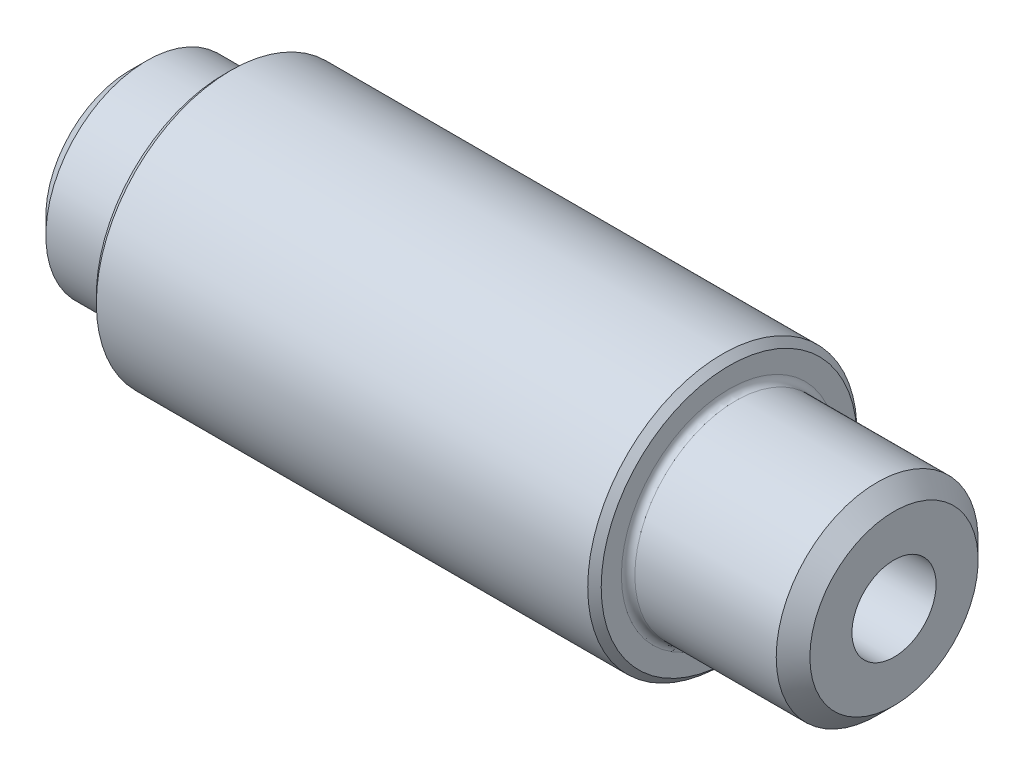
ISO-10303-21;
HEADER;
FILE_DESCRIPTION(('STEP AP214'),'2;1');
FILE_NAME('part.step','',(''),(''),'','','');
FILE_SCHEMA(('AUTOMOTIVE_DESIGN { 1 0 10303 214 1 1 1 1 }'));
ENDSEC;
DATA;
#1=APPLICATION_CONTEXT('core data for automotive mechanical design processes');
#2=APPLICATION_PROTOCOL_DEFINITION('international standard','automotive_design',2000,#1);
#3=PRODUCT_CONTEXT('',#1,'mechanical');
#4=PRODUCT('Part','Part','',(#3));
#5=PRODUCT_RELATED_PRODUCT_CATEGORY('part','',(#4));
#6=PRODUCT_DEFINITION_FORMATION('','',#4);
#7=PRODUCT_DEFINITION_CONTEXT('part definition',#1,'design');
#8=PRODUCT_DEFINITION('design','',#6,#7);
#9=PRODUCT_DEFINITION_SHAPE('','',#8);
#10=(LENGTH_UNIT() NAMED_UNIT(*) SI_UNIT(.MILLI.,.METRE.));
#11=(NAMED_UNIT(*) PLANE_ANGLE_UNIT() SI_UNIT($,.RADIAN.));
#12=(NAMED_UNIT(*) SI_UNIT($,.STERADIAN.) SOLID_ANGLE_UNIT());
#13=UNCERTAINTY_MEASURE_WITH_UNIT(LENGTH_MEASURE(1.E-05),#10,'distance_accuracy_value','');
#14=(GEOMETRIC_REPRESENTATION_CONTEXT(3) GLOBAL_UNCERTAINTY_ASSIGNED_CONTEXT((#13)) GLOBAL_UNIT_ASSIGNED_CONTEXT((#10,
#11,#12)) REPRESENTATION_CONTEXT('',''));
#15=CARTESIAN_POINT('',(0.,0.,0.));
#16=DIRECTION('',(0.,0.,1.));
#17=DIRECTION('',(1.,0.,0.));
#18=AXIS2_PLACEMENT_3D('',#15,#16,#17);
#19=CARTESIAN_POINT('',(22.7,3.,0.));
#20=DIRECTION('',(-1.,0.,0.));
#21=DIRECTION('',(0.,0.,1.));
#22=AXIS2_PLACEMENT_3D('',#19,#20,#21);
#23=PLANE('',#22);
#24=CARTESIAN_POINT('',(22.7,0.,0.));
#25=DIRECTION('',(-1.,0.,0.));
#26=DIRECTION('',(0.,0.,1.));
#27=AXIS2_PLACEMENT_3D('',#24,#25,#26);
#28=CIRCLE('',#27,2.49999999999999);
#29=CARTESIAN_POINT('',(22.7,0.,2.49999999999999));
#30=VERTEX_POINT('',#29);
#31=EDGE_CURVE('E96',#30,#30,#28,.F.);
#32=ORIENTED_EDGE('',*,*,#31,.T.);
#33=EDGE_LOOP('',(#32));
#34=FACE_BOUND('',#33,.T.);
#35=CARTESIAN_POINT('',(22.7,0.,0.));
#36=DIRECTION('',(1.,0.,0.));
#37=DIRECTION('',(0.,0.,-1.));
#38=AXIS2_PLACEMENT_3D('',#35,#36,#37);
#39=CIRCLE('',#38,1.24999999999999);
#40=CARTESIAN_POINT('',(22.7,0.,-1.24999999999999));
#41=VERTEX_POINT('',#40);
#42=EDGE_CURVE('E71',#41,#41,#39,.T.);
#43=ORIENTED_EDGE('',*,*,#42,.F.);
#44=EDGE_LOOP('',(#43));
#45=FACE_BOUND('',#44,.T.);
#46=ADVANCED_FACE('F46',(#34,#45),#23,.F.);
#47=CARTESIAN_POINT('',(0.,0.,0.));
#48=DIRECTION('',(-1.,0.,0.));
#49=DIRECTION('',(0.,0.,1.));
#50=AXIS2_PLACEMENT_3D('',#47,#48,#49);
#51=CYLINDRICAL_SURFACE('',#50,3.);
#52=CARTESIAN_POINT('',(18.,0.,0.));
#53=DIRECTION('',(-1.,0.,0.));
#54=DIRECTION('',(0.,0.,1.));
#55=AXIS2_PLACEMENT_3D('',#52,#53,#54);
#56=CIRCLE('',#55,3.);
#57=CARTESIAN_POINT('',(18.,0.,3.));
#58=VERTEX_POINT('',#57);
#59=EDGE_CURVE('E11',#58,#58,#56,.F.);
#60=ORIENTED_EDGE('',*,*,#59,.T.);
#61=EDGE_LOOP('',(#60));
#62=FACE_BOUND('',#61,.T.);
#63=CARTESIAN_POINT('',(22.2,0.,0.));
#64=DIRECTION('',(-1.,0.,0.));
#65=DIRECTION('',(0.,0.,1.));
#66=AXIS2_PLACEMENT_3D('',#63,#64,#65);
#67=CIRCLE('',#66,3.);
#68=CARTESIAN_POINT('',(22.2,0.,3.));
#69=VERTEX_POINT('',#68);
#70=EDGE_CURVE('E93',#69,#69,#67,.T.);
#71=ORIENTED_EDGE('',*,*,#70,.T.);
#72=EDGE_LOOP('',(#71));
#73=FACE_BOUND('',#72,.T.);
#74=ADVANCED_FACE('F126',(#62,#73),#51,.T.);
#75=CARTESIAN_POINT('',(17.8,3.,0.));
#76=DIRECTION('',(-1.,0.,0.));
#77=DIRECTION('',(0.,0.,1.));
#78=AXIS2_PLACEMENT_3D('',#75,#76,#77);
#79=PLANE('',#78);
#80=CARTESIAN_POINT('',(17.8,0.,0.));
#81=DIRECTION('',(-1.,0.,0.));
#82=DIRECTION('',(0.,0.,1.));
#83=AXIS2_PLACEMENT_3D('',#80,#81,#82);
#84=CIRCLE('',#83,3.2);
#85=CARTESIAN_POINT('',(17.8,0.,3.2));
#86=VERTEX_POINT('',#85);
#87=EDGE_CURVE('E54',#86,#86,#84,.T.);
#88=ORIENTED_EDGE('',*,*,#87,.T.);
#89=EDGE_LOOP('',(#88));
#90=FACE_BOUND('',#89,.T.);
#91=CARTESIAN_POINT('',(17.8,0.,0.));
#92=DIRECTION('',(-1.,0.,0.));
#93=DIRECTION('',(0.,0.,1.));
#94=AXIS2_PLACEMENT_3D('',#91,#92,#93);
#95=CIRCLE('',#94,3.8);
#96=CARTESIAN_POINT('',(17.8,0.,3.8));
#97=VERTEX_POINT('',#96);
#98=EDGE_CURVE('E84',#97,#97,#95,.F.);
#99=ORIENTED_EDGE('',*,*,#98,.T.);
#100=EDGE_LOOP('',(#99));
#101=FACE_BOUND('',#100,.T.);
#102=ADVANCED_FACE('F113',(#90,#101),#79,.F.);
#103=CARTESIAN_POINT('',(0.,0.,0.));
#104=DIRECTION('',(-1.,0.,0.));
#105=DIRECTION('',(0.,0.,1.));
#106=AXIS2_PLACEMENT_3D('',#103,#104,#105);
#107=CYLINDRICAL_SURFACE('',#106,3.99999999999999);
#108=CARTESIAN_POINT('',(3.,0.,0.));
#109=DIRECTION('',(1.,0.,0.));
#110=DIRECTION('',(0.,0.,-1.));
#111=AXIS2_PLACEMENT_3D('',#108,#109,#110);
#112=CIRCLE('',#111,3.99999999999999);
#113=CARTESIAN_POINT('',(3.,0.,-3.99999999999999));
#114=VERTEX_POINT('',#113);
#115=EDGE_CURVE('E90',#114,#114,#112,.T.);
#116=ORIENTED_EDGE('',*,*,#115,.T.);
#117=EDGE_LOOP('',(#116));
#118=FACE_BOUND('',#117,.T.);
#119=CARTESIAN_POINT('',(17.6,0.,0.));
#120=DIRECTION('',(-1.,0.,0.));
#121=DIRECTION('',(0.,0.,1.));
#122=AXIS2_PLACEMENT_3D('',#119,#120,#121);
#123=CIRCLE('',#122,3.99999999999999);
#124=CARTESIAN_POINT('',(17.6,0.,3.99999999999999));
#125=VERTEX_POINT('',#124);
#126=EDGE_CURVE('E81',#125,#125,#123,.T.);
#127=ORIENTED_EDGE('',*,*,#126,.T.);
#128=EDGE_LOOP('',(#127));
#129=FACE_BOUND('',#128,.T.);
#130=ADVANCED_FACE('F181',(#118,#129),#107,.T.);
#131=CARTESIAN_POINT('',(2.8,3.99999999999999,0.));
#132=DIRECTION('',(1.,0.,0.));
#133=DIRECTION('',(0.,0.,-1.));
#134=AXIS2_PLACEMENT_3D('',#131,#132,#133);
#135=PLANE('',#134);
#136=CARTESIAN_POINT('',(2.8,0.,0.));
#137=DIRECTION('',(1.,0.,0.));
#138=DIRECTION('',(0.,0.,-1.));
#139=AXIS2_PLACEMENT_3D('',#136,#137,#138);
#140=CIRCLE('',#139,3.2);
#141=CARTESIAN_POINT('',(2.8,0.,-3.2));
#142=VERTEX_POINT('',#141);
#143=EDGE_CURVE('E108',#142,#142,#140,.T.);
#144=ORIENTED_EDGE('',*,*,#143,.T.);
#145=EDGE_LOOP('',(#144));
#146=FACE_BOUND('',#145,.T.);
#147=CARTESIAN_POINT('',(2.8,0.,0.));
#148=DIRECTION('',(1.,0.,0.));
#149=DIRECTION('',(0.,0.,-1.));
#150=AXIS2_PLACEMENT_3D('',#147,#148,#149);
#151=CIRCLE('',#150,3.79999999999999);
#152=CARTESIAN_POINT('',(2.8,0.,-3.79999999999999));
#153=VERTEX_POINT('',#152);
#154=EDGE_CURVE('E87',#153,#153,#151,.F.);
#155=ORIENTED_EDGE('',*,*,#154,.T.);
#156=EDGE_LOOP('',(#155));
#157=FACE_BOUND('',#156,.T.);
#158=ADVANCED_FACE('F177',(#146,#157),#135,.F.);
#159=CARTESIAN_POINT('',(0.,0.,0.));
#160=DIRECTION('',(-1.,0.,0.));
#161=DIRECTION('',(0.,0.,1.));
#162=AXIS2_PLACEMENT_3D('',#159,#160,#161);
#163=CYLINDRICAL_SURFACE('',#162,3.);
#164=CARTESIAN_POINT('',(2.6,0.,0.));
#165=DIRECTION('',(1.,0.,0.));
#166=DIRECTION('',(0.,0.,-1.));
#167=AXIS2_PLACEMENT_3D('',#164,#165,#166);
#168=CIRCLE('',#167,3.);
#169=CARTESIAN_POINT('',(2.6,0.,-3.));
#170=VERTEX_POINT('',#169);
#171=EDGE_CURVE('E105',#170,#170,#168,.F.);
#172=ORIENTED_EDGE('',*,*,#171,.T.);
#173=EDGE_LOOP('',(#172));
#174=FACE_BOUND('',#173,.T.);
#175=CARTESIAN_POINT('',(0.500000000000006,0.,0.));
#176=DIRECTION('',(1.,0.,0.));
#177=DIRECTION('',(0.,0.,-1.));
#178=AXIS2_PLACEMENT_3D('',#175,#176,#177);
#179=CIRCLE('',#178,3.);
#180=CARTESIAN_POINT('',(0.500000000000006,0.,-3.));
#181=VERTEX_POINT('',#180);
#182=EDGE_CURVE('E102',#181,#181,#179,.T.);
#183=ORIENTED_EDGE('',*,*,#182,.T.);
#184=EDGE_LOOP('',(#183));
#185=FACE_BOUND('',#184,.T.);
#186=ADVANCED_FACE('F161',(#174,#185),#163,.T.);
#187=CARTESIAN_POINT('',(0.,3.,0.));
#188=DIRECTION('',(1.,0.,0.));
#189=DIRECTION('',(0.,0.,-1.));
#190=AXIS2_PLACEMENT_3D('',#187,#188,#189);
#191=PLANE('',#190);
#192=CARTESIAN_POINT('',(0.,0.,0.));
#193=DIRECTION('',(1.,0.,0.));
#194=DIRECTION('',(0.,0.,-1.));
#195=AXIS2_PLACEMENT_3D('',#192,#193,#194);
#196=CIRCLE('',#195,2.5);
#197=CARTESIAN_POINT('',(0.,0.,-2.5));
#198=VERTEX_POINT('',#197);
#199=EDGE_CURVE('E99',#198,#198,#196,.F.);
#200=ORIENTED_EDGE('',*,*,#199,.T.);
#201=EDGE_LOOP('',(#200));
#202=FACE_BOUND('',#201,.T.);
#203=CARTESIAN_POINT('',(0.,0.,0.));
#204=DIRECTION('',(-1.,0.,0.));
#205=DIRECTION('',(0.,0.,1.));
#206=AXIS2_PLACEMENT_3D('',#203,#204,#205);
#207=CIRCLE('',#206,1.24999999999999);
#208=CARTESIAN_POINT('',(0.,0.,1.24999999999999));
#209=VERTEX_POINT('',#208);
#210=EDGE_CURVE('E70',#209,#209,#207,.T.);
#211=ORIENTED_EDGE('',*,*,#210,.F.);
#212=EDGE_LOOP('',(#211));
#213=FACE_BOUND('',#212,.T.);
#214=ADVANCED_FACE('F157',(#202,#213),#191,.F.);
#215=CARTESIAN_POINT('',(8.50000000000001,0.,0.));
#216=DIRECTION('',(-1.,0.,0.));
#217=DIRECTION('',(0.,0.,1.));
#218=AXIS2_PLACEMENT_3D('',#215,#216,#217);
#219=CONICAL_SURFACE('',#218,1.24999999999999,1.02974425867665);
#220=CARTESIAN_POINT('',(9.25107577378445,0.,0.));
#221=VERTEX_POINT('',#220);
#222=VERTEX_LOOP('',#221);
#223=FACE_BOUND('',#222,.T.);
#224=CARTESIAN_POINT('',(8.50000000000001,0.,0.));
#225=DIRECTION('',(-1.,0.,0.));
#226=DIRECTION('',(0.,0.,1.));
#227=AXIS2_PLACEMENT_3D('',#224,#225,#226);
#228=CIRCLE('',#227,1.24999999999999);
#229=CARTESIAN_POINT('',(8.50000000000001,0.,1.24999999999999));
#230=VERTEX_POINT('',#229);
#231=EDGE_CURVE('E74',#230,#230,#228,.T.);
#232=ORIENTED_EDGE('',*,*,#231,.T.);
#233=EDGE_LOOP('',(#232));
#234=FACE_BOUND('',#233,.T.);
#235=ADVANCED_FACE('F160',(#223,#234),#219,.F.);
#236=CARTESIAN_POINT('',(0.,0.,0.));
#237=DIRECTION('',(-1.,0.,0.));
#238=DIRECTION('',(0.,0.,1.));
#239=AXIS2_PLACEMENT_3D('',#236,#237,#238);
#240=CYLINDRICAL_SURFACE('',#239,1.24999999999999);
#241=ORIENTED_EDGE('',*,*,#231,.F.);
#242=EDGE_LOOP('',(#241));
#243=FACE_BOUND('',#242,.T.);
#244=ORIENTED_EDGE('',*,*,#210,.T.);
#245=EDGE_LOOP('',(#244));
#246=FACE_BOUND('',#245,.T.);
#247=ADVANCED_FACE('F64',(#243,#246),#240,.F.);
#248=CARTESIAN_POINT('',(14.2,0.,0.));
#249=DIRECTION('',(1.,0.,0.));
#250=DIRECTION('',(0.,0.,-1.));
#251=AXIS2_PLACEMENT_3D('',#248,#249,#250);
#252=CONICAL_SURFACE('',#251,1.24999999999999,1.02974425867665);
#253=CARTESIAN_POINT('',(13.4489242262156,0.,0.));
#254=VERTEX_POINT('',#253);
#255=VERTEX_LOOP('',#254);
#256=FACE_BOUND('',#255,.T.);
#257=CARTESIAN_POINT('',(14.2,0.,0.));
#258=DIRECTION('',(1.,0.,0.));
#259=DIRECTION('',(0.,0.,-1.));
#260=AXIS2_PLACEMENT_3D('',#257,#258,#259);
#261=CIRCLE('',#260,1.24999999999999);
#262=CARTESIAN_POINT('',(14.2,0.,-1.24999999999999));
#263=VERTEX_POINT('',#262);
#264=EDGE_CURVE('E68',#263,#263,#261,.T.);
#265=ORIENTED_EDGE('',*,*,#264,.T.);
#266=EDGE_LOOP('',(#265));
#267=FACE_BOUND('',#266,.T.);
#268=ADVANCED_FACE('F60',(#256,#267),#252,.F.);
#269=CARTESIAN_POINT('',(22.7,0.,0.));
#270=DIRECTION('',(1.,0.,0.));
#271=DIRECTION('',(0.,0.,-1.));
#272=AXIS2_PLACEMENT_3D('',#269,#270,#271);
#273=CYLINDRICAL_SURFACE('',#272,1.24999999999999);
#274=ORIENTED_EDGE('',*,*,#264,.F.);
#275=EDGE_LOOP('',(#274));
#276=FACE_BOUND('',#275,.T.);
#277=ORIENTED_EDGE('',*,*,#42,.T.);
#278=EDGE_LOOP('',(#277));
#279=FACE_BOUND('',#278,.T.);
#280=ADVANCED_FACE('F63',(#276,#279),#273,.F.);
#281=CARTESIAN_POINT('',(17.6,0.,0.));
#282=DIRECTION('',(-1.,0.,0.));
#283=DIRECTION('',(0.,0.,1.));
#284=AXIS2_PLACEMENT_3D('',#281,#282,#283);
#285=CONICAL_SURFACE('',#284,3.99999999999999,0.78539816339745);
#286=ORIENTED_EDGE('',*,*,#98,.F.);
#287=EDGE_LOOP('',(#286));
#288=FACE_BOUND('',#287,.T.);
#289=ORIENTED_EDGE('',*,*,#126,.F.);
#290=EDGE_LOOP('',(#289));
#291=FACE_BOUND('',#290,.T.);
#292=ADVANCED_FACE('F137',(#288,#291),#285,.T.);
#293=CARTESIAN_POINT('',(2.8,0.,0.));
#294=DIRECTION('',(1.,0.,0.));
#295=DIRECTION('',(0.,0.,-1.));
#296=AXIS2_PLACEMENT_3D('',#293,#294,#295);
#297=CONICAL_SURFACE('',#296,3.79999999999999,0.785398163397448);
#298=CARTESIAN_POINT('',(3.,0.,-3.99999999999999));
#299=CARTESIAN_POINT('',(2.99791666666667,0.,-3.99791666666666));
#300=CARTESIAN_POINT('',(2.99583333333333,0.,-3.99583333333333));
#301=CARTESIAN_POINT('',(2.99166666666666,0.,-3.99166666666666));
#302=CARTESIAN_POINT('',(2.98958333333333,0.,-3.98958333333333));
#303=CARTESIAN_POINT('',(2.98541666666666,0.,-3.98541666666666));
#304=CARTESIAN_POINT('',(2.98333333333333,0.,-3.98333333333333));
#305=CARTESIAN_POINT('',(2.97916666666667,0.,-3.97916666666666));
#306=CARTESIAN_POINT('',(2.97708333333333,0.,-3.97708333333333));
#307=CARTESIAN_POINT('',(2.97291666666666,0.,-3.97291666666666));
#308=CARTESIAN_POINT('',(2.97083333333333,0.,-3.97083333333333));
#309=CARTESIAN_POINT('',(2.96666666666667,0.,-3.96666666666666));
#310=CARTESIAN_POINT('',(2.96458333333333,0.,-3.96458333333333));
#311=CARTESIAN_POINT('',(2.96041666666666,0.,-3.96041666666666));
#312=CARTESIAN_POINT('',(2.95833333333333,0.,-3.95833333333333));
#313=CARTESIAN_POINT('',(2.95416666666666,0.,-3.95416666666666));
#314=CARTESIAN_POINT('',(2.95208333333333,0.,-3.95208333333333));
#315=CARTESIAN_POINT('',(2.94791666666667,0.,-3.94791666666666));
#316=CARTESIAN_POINT('',(2.94583333333333,0.,-3.94583333333333));
#317=CARTESIAN_POINT('',(2.94166666666666,0.,-3.94166666666666));
#318=CARTESIAN_POINT('',(2.93958333333333,0.,-3.93958333333333));
#319=CARTESIAN_POINT('',(2.93541666666666,0.,-3.93541666666666));
#320=CARTESIAN_POINT('',(2.93333333333333,0.,-3.93333333333333));
#321=CARTESIAN_POINT('',(2.92916666666666,0.,-3.92916666666666));
#322=CARTESIAN_POINT('',(2.92708333333333,0.,-3.92708333333333));
#323=CARTESIAN_POINT('',(2.92291666666667,0.,-3.92291666666666));
#324=CARTESIAN_POINT('',(2.92083333333333,0.,-3.92083333333333));
#325=CARTESIAN_POINT('',(2.91666666666666,0.,-3.91666666666666));
#326=CARTESIAN_POINT('',(2.91458333333333,0.,-3.91458333333333));
#327=CARTESIAN_POINT('',(2.91041666666667,0.,-3.91041666666666));
#328=CARTESIAN_POINT('',(2.90833333333333,0.,-3.90833333333333));
#329=CARTESIAN_POINT('',(2.90416666666666,0.,-3.90416666666666));
#330=CARTESIAN_POINT('',(2.90208333333333,0.,-3.90208333333333));
#331=CARTESIAN_POINT('',(2.89791666666666,0.,-3.89791666666666));
#332=CARTESIAN_POINT('',(2.89583333333333,0.,-3.89583333333333));
#333=CARTESIAN_POINT('',(2.89166666666666,0.,-3.89166666666666));
#334=CARTESIAN_POINT('',(2.88958333333333,0.,-3.88958333333333));
#335=CARTESIAN_POINT('',(2.88541666666667,0.,-3.88541666666666));
#336=CARTESIAN_POINT('',(2.88333333333333,0.,-3.88333333333333));
#337=CARTESIAN_POINT('',(2.87916666666666,0.,-3.87916666666666));
#338=CARTESIAN_POINT('',(2.87708333333333,0.,-3.87708333333333));
#339=CARTESIAN_POINT('',(2.87291666666667,0.,-3.87291666666666));
#340=CARTESIAN_POINT('',(2.87083333333333,0.,-3.87083333333333));
#341=CARTESIAN_POINT('',(2.86666666666666,0.,-3.86666666666666));
#342=CARTESIAN_POINT('',(2.86458333333333,0.,-3.86458333333333));
#343=CARTESIAN_POINT('',(2.86041666666667,0.,-3.86041666666666));
#344=CARTESIAN_POINT('',(2.85833333333333,0.,-3.85833333333333));
#345=CARTESIAN_POINT('',(2.85416666666667,0.,-3.85416666666666));
#346=CARTESIAN_POINT('',(2.85208333333333,0.,-3.85208333333333));
#347=CARTESIAN_POINT('',(2.84791666666666,0.,-3.84791666666666));
#348=CARTESIAN_POINT('',(2.84583333333333,0.,-3.84583333333333));
#349=CARTESIAN_POINT('',(2.84166666666667,0.,-3.84166666666666));
#350=CARTESIAN_POINT('',(2.83958333333333,0.,-3.83958333333333));
#351=CARTESIAN_POINT('',(2.83541666666666,0.,-3.83541666666666));
#352=CARTESIAN_POINT('',(2.83333333333333,0.,-3.83333333333333));
#353=CARTESIAN_POINT('',(2.82916666666667,0.,-3.82916666666666));
#354=CARTESIAN_POINT('',(2.82708333333333,0.,-3.82708333333333));
#355=CARTESIAN_POINT('',(2.82291666666667,0.,-3.82291666666666));
#356=CARTESIAN_POINT('',(2.82083333333333,0.,-3.82083333333333));
#357=CARTESIAN_POINT('',(2.81666666666667,0.,-3.81666666666666));
#358=CARTESIAN_POINT('',(2.81458333333333,0.,-3.81458333333333));
#359=CARTESIAN_POINT('',(2.81041666666667,0.,-3.81041666666666));
#360=CARTESIAN_POINT('',(2.80833333333333,0.,-3.80833333333333));
#361=CARTESIAN_POINT('',(2.80416666666667,0.,-3.80416666666666));
#362=CARTESIAN_POINT('',(2.80208333333333,0.,-3.80208333333333));
#363=CARTESIAN_POINT('',(2.8,0.,-3.79999999999999));
#364=B_SPLINE_CURVE_WITH_KNOTS('',3,(#298,#299,#300,#301,#302,#303,#304,#305,#306,#307,#308,
#309,#310,#311,#312,#313,#314,#315,#316,#317,#318,#319,#320,#321,#322,#323,#324,#325,#326,#327,
#328,#329,#330,#331,#332,#333,#334,#335,#336,#337,#338,#339,#340,#341,#342,#343,#344,#345,#346,
#347,#348,#349,#350,#351,#352,#353,#354,#355,#356,#357,#358,#359,#360,#361,#362,#363),
.UNSPECIFIED.,.F.,.F.,(4,2,2,2,2,2,2,2,2,2,2,2,2,2,2,2,2,2,2,2,2,2,2,2,2,2,2,2,2,2,2,2,4),(0.,
0.00883883476483179,0.0176776695296639,0.0265165042944957,0.0353553390593272,0.0441941738241589,
0.053033008588991,0.0618718433538231,0.0707106781186549,0.0795495128834864,0.0883883476483182,
0.0972271824131503,0.106066017177982,0.114904851942814,0.123743686707645,0.132582521472477,
0.14142135623731,0.150260191002141,0.159099025766973,0.167937860531805,0.176776695296637,
0.185615530061468,0.1944543648263,0.203293199591132,0.212132034355964,0.220970869120796,
0.229809703885627,0.23864853865046,0.247487373415291,0.256326208180123,0.265165042944955,
0.274003877709787,0.282842712474618),.UNSPECIFIED.);
#365=EDGE_CURVE('BSEAM140',#114,#153,#364,.T.);
#366=ORIENTED_EDGE('',*,*,#115,.F.);
#367=ORIENTED_EDGE('',*,*,#154,.F.);
#368=ORIENTED_EDGE('',*,*,#365,.T.);
#369=ORIENTED_EDGE('',*,*,#365,.F.);
#370=EDGE_LOOP('',(#366,#368,#367,#369));
#371=FACE_BOUND('',#370,.T.);
#372=ADVANCED_FACE('F140',(#371),#297,.T.);
#373=CARTESIAN_POINT('',(22.2,0.,0.));
#374=DIRECTION('',(-1.,0.,0.));
#375=DIRECTION('',(0.,0.,1.));
#376=AXIS2_PLACEMENT_3D('',#373,#374,#375);
#377=CONICAL_SURFACE('',#376,3.,0.785398163397458);
#378=ORIENTED_EDGE('',*,*,#31,.F.);
#379=EDGE_LOOP('',(#378));
#380=FACE_BOUND('',#379,.T.);
#381=ORIENTED_EDGE('',*,*,#70,.F.);
#382=EDGE_LOOP('',(#381));
#383=FACE_BOUND('',#382,.T.);
#384=ADVANCED_FACE('F144',(#380,#383),#377,.T.);
#385=CARTESIAN_POINT('',(0.,0.,0.));
#386=DIRECTION('',(1.,0.,0.));
#387=DIRECTION('',(0.,0.,-1.));
#388=AXIS2_PLACEMENT_3D('',#385,#386,#387);
#389=CONICAL_SURFACE('',#388,2.5,0.785398163397445);
#390=ORIENTED_EDGE('',*,*,#182,.F.);
#391=EDGE_LOOP('',(#390));
#392=FACE_BOUND('',#391,.T.);
#393=ORIENTED_EDGE('',*,*,#199,.F.);
#394=EDGE_LOOP('',(#393));
#395=FACE_BOUND('',#394,.T.);
#396=ADVANCED_FACE('F122',(#392,#395),#389,.T.);
#397=CARTESIAN_POINT('',(2.6,0.,0.));
#398=DIRECTION('',(1.,0.,0.));
#399=DIRECTION('',(0.,0.,-1.));
#400=AXIS2_PLACEMENT_3D('',#397,#398,#399);
#401=TOROIDAL_SURFACE('',#400,3.2,0.2);
#402=ORIENTED_EDGE('',*,*,#143,.F.);
#403=EDGE_LOOP('',(#402));
#404=FACE_BOUND('',#403,.T.);
#405=ORIENTED_EDGE('',*,*,#171,.F.);
#406=EDGE_LOOP('',(#405));
#407=FACE_BOUND('',#406,.T.);
#408=ADVANCED_FACE('F117',(#404,#407),#401,.F.);
#409=CARTESIAN_POINT('',(18.,0.,0.));
#410=DIRECTION('',(-1.,0.,0.));
#411=DIRECTION('',(0.,0.,1.));
#412=AXIS2_PLACEMENT_3D('',#409,#410,#411);
#413=TOROIDAL_SURFACE('',#412,3.2,0.2);
#414=ORIENTED_EDGE('',*,*,#59,.F.);
#415=EDGE_LOOP('',(#414));
#416=FACE_BOUND('',#415,.T.);
#417=ORIENTED_EDGE('',*,*,#87,.F.);
#418=EDGE_LOOP('',(#417));
#419=FACE_BOUND('',#418,.T.);
#420=ADVANCED_FACE('F48',(#416,#419),#413,.F.);
#421=CLOSED_SHELL('',(#46,#74,#102,#130,#158,#186,#214,#235,#247,#268,#280,#292,#372,#384,#396,
#408,#420));
#422=MANIFOLD_SOLID_BREP('B2',#421);
#423=ADVANCED_BREP_SHAPE_REPRESENTATION('',(#18,#422),#14);
#424=SHAPE_DEFINITION_REPRESENTATION(#9,#423);
ENDSEC;
END-ISO-10303-21;
